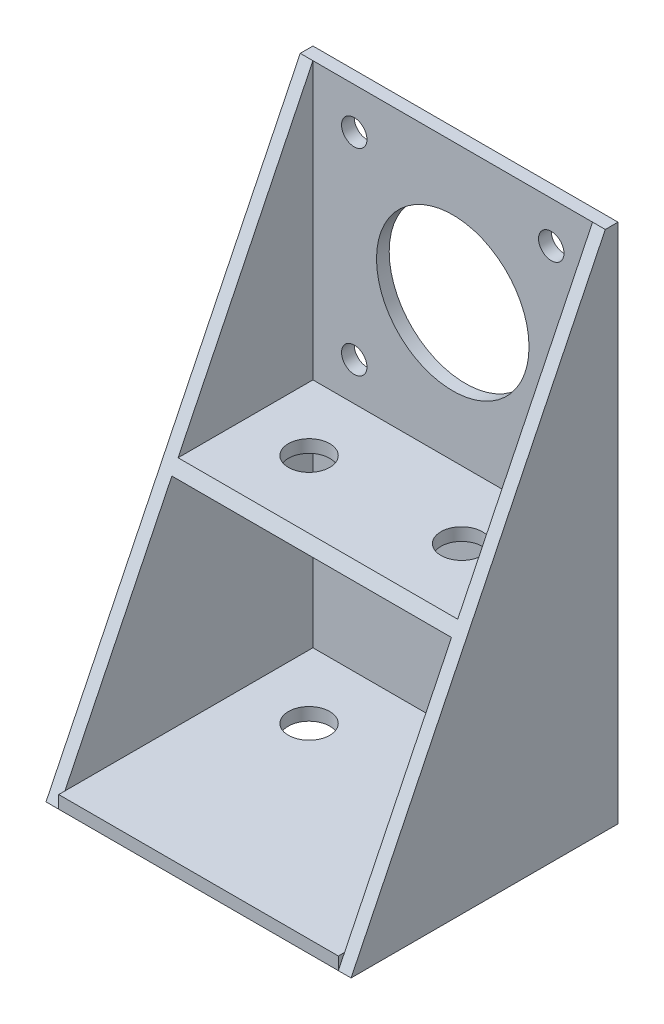
ISO-10303-21;
HEADER;
FILE_DESCRIPTION(('STEP AP214'),'2;1');
FILE_NAME('part.step','',(''),(''),'','','');
FILE_SCHEMA(('AUTOMOTIVE_DESIGN { 1 0 10303 214 1 1 1 1 }'));
ENDSEC;
DATA;
#1=APPLICATION_CONTEXT('core data for automotive mechanical design processes');
#2=APPLICATION_PROTOCOL_DEFINITION('international standard','automotive_design',2000,#1);
#3=PRODUCT_CONTEXT('',#1,'mechanical');
#4=PRODUCT('Part','Part','',(#3));
#5=PRODUCT_RELATED_PRODUCT_CATEGORY('part','',(#4));
#6=PRODUCT_DEFINITION_FORMATION('','',#4);
#7=PRODUCT_DEFINITION_CONTEXT('part definition',#1,'design');
#8=PRODUCT_DEFINITION('design','',#6,#7);
#9=PRODUCT_DEFINITION_SHAPE('','',#8);
#10=(LENGTH_UNIT() NAMED_UNIT(*) SI_UNIT(.MILLI.,.METRE.));
#11=(NAMED_UNIT(*) PLANE_ANGLE_UNIT() SI_UNIT($,.RADIAN.));
#12=(NAMED_UNIT(*) SI_UNIT($,.STERADIAN.) SOLID_ANGLE_UNIT());
#13=UNCERTAINTY_MEASURE_WITH_UNIT(LENGTH_MEASURE(1.E-05),#10,'distance_accuracy_value','');
#14=(GEOMETRIC_REPRESENTATION_CONTEXT(3) GLOBAL_UNCERTAINTY_ASSIGNED_CONTEXT((#13)) GLOBAL_UNIT_ASSIGNED_CONTEXT((#10,
#11,#12)) REPRESENTATION_CONTEXT('',''));
#15=CARTESIAN_POINT('',(0.,0.,0.));
#16=DIRECTION('',(0.,0.,1.));
#17=DIRECTION('',(1.,0.,0.));
#18=AXIS2_PLACEMENT_3D('',#15,#16,#17);
#19=CARTESIAN_POINT('',(0.,0.,2.));
#20=DIRECTION('',(0.,0.,1.));
#21=DIRECTION('',(1.,0.,0.));
#22=AXIS2_PLACEMENT_3D('',#19,#20,#21);
#23=PLANE('',#22);
#24=DIRECTION('',(1.,0.,0.));
#25=VECTOR('',#24,1.);
#26=CARTESIAN_POINT('',(-22.,-58.,2.));
#27=LINE('',#26,#25);
#28=CARTESIAN_POINT('',(-22.,-58.,2.));
#29=VERTEX_POINT('',#28);
#30=CARTESIAN_POINT('',(22.,-58.,2.));
#31=VERTEX_POINT('',#30);
#32=EDGE_CURVE('E131',#29,#31,#27,.T.);
#33=ORIENTED_EDGE('',*,*,#32,.T.);
#34=DIRECTION('',(0.,1.,0.));
#35=VECTOR('',#34,1.);
#36=CARTESIAN_POINT('',(22.,22.,2.));
#37=LINE('',#36,#35);
#38=CARTESIAN_POINT('',(22.,-23.5,2.));
#39=VERTEX_POINT('',#38);
#40=EDGE_CURVE('E157',#31,#39,#37,.T.);
#41=ORIENTED_EDGE('',*,*,#40,.T.);
#42=DIRECTION('',(1.,0.,0.));
#43=VECTOR('',#42,1.);
#44=CARTESIAN_POINT('',(-22.,-23.5,2.));
#45=LINE('',#44,#43);
#46=CARTESIAN_POINT('',(-22.,-23.5,2.));
#47=VERTEX_POINT('',#46);
#48=EDGE_CURVE('E154',#47,#39,#45,.T.);
#49=ORIENTED_EDGE('',*,*,#48,.F.);
#50=DIRECTION('',(0.,-1.,0.));
#51=VECTOR('',#50,1.);
#52=CARTESIAN_POINT('',(-22.,22.,2.));
#53=LINE('',#52,#51);
#54=EDGE_CURVE('E42',#47,#29,#53,.T.);
#55=ORIENTED_EDGE('',*,*,#54,.T.);
#56=EDGE_LOOP('',(#33,#41,#49,#55));
#57=FACE_BOUND('',#56,.T.);
#58=ADVANCED_FACE('F33',(#57),#23,.T.);
#59=CARTESIAN_POINT('',(-22.,22.,2.));
#60=DIRECTION('',(0.,-1.,0.));
#61=DIRECTION('',(0.,0.,-1.));
#62=AXIS2_PLACEMENT_3D('',#59,#60,#61);
#63=PLANE('',#62);
#64=DIRECTION('',(-1.,0.,0.));
#65=VECTOR('',#64,1.);
#66=CARTESIAN_POINT('',(-22.,22.,0.));
#67=LINE('',#66,#65);
#68=CARTESIAN_POINT('',(24.,22.,0.));
#69=VERTEX_POINT('',#68);
#70=CARTESIAN_POINT('',(-24.,22.,0.));
#71=VERTEX_POINT('',#70);
#72=EDGE_CURVE('E168',#69,#71,#67,.T.);
#73=ORIENTED_EDGE('',*,*,#72,.T.);
#74=DIRECTION('',(0.,0.,-1.));
#75=VECTOR('',#74,1.);
#76=CARTESIAN_POINT('',(-24.,22.,0.));
#77=LINE('',#76,#75);
#78=CARTESIAN_POINT('',(-24.,22.,2.));
#79=VERTEX_POINT('',#78);
#80=EDGE_CURVE('E238',#79,#71,#77,.T.);
#81=ORIENTED_EDGE('',*,*,#80,.F.);
#82=DIRECTION('',(1.,0.,0.));
#83=VECTOR('',#82,1.);
#84=CARTESIAN_POINT('',(-24.,22.,2.));
#85=LINE('',#84,#83);
#86=CARTESIAN_POINT('',(-22.,22.,2.));
#87=VERTEX_POINT('',#86);
#88=EDGE_CURVE('E249',#79,#87,#85,.T.);
#89=ORIENTED_EDGE('',*,*,#88,.T.);
#90=DIRECTION('',(-1.,0.,0.));
#91=VECTOR('',#90,1.);
#92=CARTESIAN_POINT('',(-22.,22.,2.));
#93=LINE('',#92,#91);
#94=CARTESIAN_POINT('',(22.,22.,2.));
#95=VERTEX_POINT('',#94);
#96=EDGE_CURVE('E155',#95,#87,#93,.T.);
#97=ORIENTED_EDGE('',*,*,#96,.F.);
#98=DIRECTION('',(-1.,0.,0.));
#99=VECTOR('',#98,1.);
#100=CARTESIAN_POINT('',(24.,22.,2.));
#101=LINE('',#100,#99);
#102=CARTESIAN_POINT('',(24.,22.,2.));
#103=VERTEX_POINT('',#102);
#104=EDGE_CURVE('E234',#103,#95,#101,.T.);
#105=ORIENTED_EDGE('',*,*,#104,.F.);
#106=DIRECTION('',(0.,0.,1.));
#107=VECTOR('',#106,1.);
#108=CARTESIAN_POINT('',(24.,22.,2.));
#109=LINE('',#108,#107);
#110=EDGE_CURVE('E220',#69,#103,#109,.T.);
#111=ORIENTED_EDGE('',*,*,#110,.F.);
#112=EDGE_LOOP('',(#73,#81,#89,#97,#105,#111));
#113=FACE_BOUND('',#112,.T.);
#114=ADVANCED_FACE('F35',(#113),#63,.F.);
#115=DIRECTION('',(-1.,0.,0.));
#116=VECTOR('',#115,1.);
#117=CARTESIAN_POINT('',(-22.,-21.5,2.));
#118=LINE('',#117,#116);
#119=CARTESIAN_POINT('',(22.,-21.5,2.));
#120=VERTEX_POINT('',#119);
#121=CARTESIAN_POINT('',(-22.,-21.5,2.));
#122=VERTEX_POINT('',#121);
#123=EDGE_CURVE('E162',#120,#122,#118,.T.);
#124=ORIENTED_EDGE('',*,*,#123,.F.);
#125=EDGE_CURVE('E170',#120,#95,#37,.T.);
#126=ORIENTED_EDGE('',*,*,#125,.T.);
#127=ORIENTED_EDGE('',*,*,#96,.T.);
#128=EDGE_CURVE('E11',#87,#122,#53,.T.);
#129=ORIENTED_EDGE('',*,*,#128,.T.);
#130=EDGE_LOOP('',(#124,#126,#127,#129));
#131=FACE_BOUND('',#130,.T.);
#132=CARTESIAN_POINT('',(15.5,-15.5,2.));
#133=DIRECTION('',(0.,0.,1.));
#134=DIRECTION('',(1.,0.,0.));
#135=AXIS2_PLACEMENT_3D('',#132,#133,#134);
#136=CIRCLE('',#135,2.);
#137=CARTESIAN_POINT('',(17.5,-15.5,2.));
#138=VERTEX_POINT('',#137);
#139=EDGE_CURVE('E277',#138,#138,#136,.T.);
#140=ORIENTED_EDGE('',*,*,#139,.F.);
#141=EDGE_LOOP('',(#140));
#142=FACE_BOUND('',#141,.T.);
#143=CARTESIAN_POINT('',(-15.5,-15.5,2.));
#144=DIRECTION('',(0.,0.,1.));
#145=DIRECTION('',(1.,0.,0.));
#146=AXIS2_PLACEMENT_3D('',#143,#144,#145);
#147=CIRCLE('',#146,2.);
#148=CARTESIAN_POINT('',(-13.5,-15.5,2.));
#149=VERTEX_POINT('',#148);
#150=EDGE_CURVE('E284',#149,#149,#147,.T.);
#151=ORIENTED_EDGE('',*,*,#150,.F.);
#152=EDGE_LOOP('',(#151));
#153=FACE_BOUND('',#152,.T.);
#154=CARTESIAN_POINT('',(15.5,15.5,2.));
#155=DIRECTION('',(0.,0.,1.));
#156=DIRECTION('',(1.,0.,0.));
#157=AXIS2_PLACEMENT_3D('',#154,#155,#156);
#158=CIRCLE('',#157,2.);
#159=CARTESIAN_POINT('',(17.5,15.5,2.));
#160=VERTEX_POINT('',#159);
#161=EDGE_CURVE('E290',#160,#160,#158,.T.);
#162=ORIENTED_EDGE('',*,*,#161,.F.);
#163=EDGE_LOOP('',(#162));
#164=FACE_BOUND('',#163,.T.);
#165=CARTESIAN_POINT('',(0.,0.,2.));
#166=DIRECTION('',(0.,0.,1.));
#167=DIRECTION('',(1.,0.,0.));
#168=AXIS2_PLACEMENT_3D('',#165,#166,#167);
#169=CIRCLE('',#168,12.);
#170=CARTESIAN_POINT('',(12.,0.,2.));
#171=VERTEX_POINT('',#170);
#172=EDGE_CURVE('E296',#171,#171,#169,.T.);
#173=ORIENTED_EDGE('',*,*,#172,.F.);
#174=EDGE_LOOP('',(#173));
#175=FACE_BOUND('',#174,.T.);
#176=CARTESIAN_POINT('',(-15.5,15.5,2.));
#177=DIRECTION('',(0.,0.,1.));
#178=DIRECTION('',(1.,0.,0.));
#179=AXIS2_PLACEMENT_3D('',#176,#177,#178);
#180=CIRCLE('',#179,2.);
#181=CARTESIAN_POINT('',(-13.5,15.5,2.));
#182=VERTEX_POINT('',#181);
#183=EDGE_CURVE('E174',#182,#182,#180,.T.);
#184=ORIENTED_EDGE('',*,*,#183,.F.);
#185=EDGE_LOOP('',(#184));
#186=FACE_BOUND('',#185,.T.);
#187=ADVANCED_FACE('F308',(#131,#142,#153,#164,#175,#186),#23,.T.);
#188=CARTESIAN_POINT('',(0.,0.,0.));
#189=DIRECTION('',(0.,0.,1.));
#190=DIRECTION('',(1.,0.,0.));
#191=AXIS2_PLACEMENT_3D('',#188,#189,#190);
#192=PLANE('',#191);
#193=CARTESIAN_POINT('',(15.5,-15.5,0.));
#194=DIRECTION('',(0.,0.,1.));
#195=DIRECTION('',(1.,0.,0.));
#196=AXIS2_PLACEMENT_3D('',#193,#194,#195);
#197=CIRCLE('',#196,2.);
#198=CARTESIAN_POINT('',(17.5,-15.5,0.));
#199=VERTEX_POINT('',#198);
#200=EDGE_CURVE('E272',#199,#199,#197,.T.);
#201=ORIENTED_EDGE('',*,*,#200,.T.);
#202=EDGE_LOOP('',(#201));
#203=FACE_BOUND('',#202,.T.);
#204=CARTESIAN_POINT('',(-15.5,-15.5,0.));
#205=DIRECTION('',(0.,0.,1.));
#206=DIRECTION('',(1.,0.,0.));
#207=AXIS2_PLACEMENT_3D('',#204,#205,#206);
#208=CIRCLE('',#207,2.);
#209=CARTESIAN_POINT('',(-13.5,-15.5,0.));
#210=VERTEX_POINT('',#209);
#211=EDGE_CURVE('E282',#210,#210,#208,.T.);
#212=ORIENTED_EDGE('',*,*,#211,.T.);
#213=EDGE_LOOP('',(#212));
#214=FACE_BOUND('',#213,.T.);
#215=CARTESIAN_POINT('',(15.5,15.5,0.));
#216=DIRECTION('',(0.,0.,1.));
#217=DIRECTION('',(1.,0.,0.));
#218=AXIS2_PLACEMENT_3D('',#215,#216,#217);
#219=CIRCLE('',#218,2.);
#220=CARTESIAN_POINT('',(17.5,15.5,0.));
#221=VERTEX_POINT('',#220);
#222=EDGE_CURVE('E287',#221,#221,#219,.T.);
#223=ORIENTED_EDGE('',*,*,#222,.T.);
#224=EDGE_LOOP('',(#223));
#225=FACE_BOUND('',#224,.T.);
#226=CARTESIAN_POINT('',(0.,0.,0.));
#227=DIRECTION('',(0.,0.,1.));
#228=DIRECTION('',(1.,0.,0.));
#229=AXIS2_PLACEMENT_3D('',#226,#227,#228);
#230=CIRCLE('',#229,12.);
#231=CARTESIAN_POINT('',(12.,0.,0.));
#232=VERTEX_POINT('',#231);
#233=EDGE_CURVE('E293',#232,#232,#230,.T.);
#234=ORIENTED_EDGE('',*,*,#233,.T.);
#235=EDGE_LOOP('',(#234));
#236=FACE_BOUND('',#235,.T.);
#237=CARTESIAN_POINT('',(-15.5,15.5,0.));
#238=DIRECTION('',(0.,0.,1.));
#239=DIRECTION('',(1.,0.,0.));
#240=AXIS2_PLACEMENT_3D('',#237,#238,#239);
#241=CIRCLE('',#240,2.);
#242=CARTESIAN_POINT('',(-13.5,15.5,0.));
#243=VERTEX_POINT('',#242);
#244=EDGE_CURVE('E171',#243,#243,#241,.T.);
#245=ORIENTED_EDGE('',*,*,#244,.T.);
#246=EDGE_LOOP('',(#245));
#247=FACE_BOUND('',#246,.T.);
#248=ORIENTED_EDGE('',*,*,#72,.F.);
#249=DIRECTION('',(0.,1.,0.));
#250=VECTOR('',#249,1.);
#251=CARTESIAN_POINT('',(24.,22.,0.));
#252=LINE('',#251,#250);
#253=CARTESIAN_POINT('',(24.,-60.,0.));
#254=VERTEX_POINT('',#253);
#255=EDGE_CURVE('E217',#254,#69,#252,.T.);
#256=ORIENTED_EDGE('',*,*,#255,.F.);
#257=DIRECTION('',(1.,0.,0.));
#258=VECTOR('',#257,1.);
#259=CARTESIAN_POINT('',(-22.,-60.,0.));
#260=LINE('',#259,#258);
#261=CARTESIAN_POINT('',(-24.,-60.,0.));
#262=VERTEX_POINT('',#261);
#263=EDGE_CURVE('E259',#262,#254,#260,.T.);
#264=ORIENTED_EDGE('',*,*,#263,.F.);
#265=DIRECTION('',(0.,-1.,0.));
#266=VECTOR('',#265,1.);
#267=CARTESIAN_POINT('',(-24.,-60.,0.));
#268=LINE('',#267,#266);
#269=EDGE_CURVE('E241',#71,#262,#268,.T.);
#270=ORIENTED_EDGE('',*,*,#269,.F.);
#271=EDGE_LOOP('',(#248,#256,#264,#270));
#272=FACE_BOUND('',#271,.T.);
#273=ADVANCED_FACE('F310',(#203,#214,#225,#236,#247,#272),#192,.F.);
#274=CARTESIAN_POINT('',(-15.5,15.5,0.));
#275=DIRECTION('',(0.,0.,1.));
#276=DIRECTION('',(1.,0.,0.));
#277=AXIS2_PLACEMENT_3D('',#274,#275,#276);
#278=CYLINDRICAL_SURFACE('',#277,2.);
#279=ORIENTED_EDGE('',*,*,#244,.F.);
#280=EDGE_LOOP('',(#279));
#281=FACE_BOUND('',#280,.T.);
#282=ORIENTED_EDGE('',*,*,#183,.T.);
#283=EDGE_LOOP('',(#282));
#284=FACE_BOUND('',#283,.T.);
#285=ADVANCED_FACE('F306',(#281,#284),#278,.F.);
#286=CARTESIAN_POINT('',(0.,0.,0.));
#287=DIRECTION('',(0.,0.,1.));
#288=DIRECTION('',(1.,0.,0.));
#289=AXIS2_PLACEMENT_3D('',#286,#287,#288);
#290=CYLINDRICAL_SURFACE('',#289,12.);
#291=ORIENTED_EDGE('',*,*,#233,.F.);
#292=EDGE_LOOP('',(#291));
#293=FACE_BOUND('',#292,.T.);
#294=ORIENTED_EDGE('',*,*,#172,.T.);
#295=EDGE_LOOP('',(#294));
#296=FACE_BOUND('',#295,.T.);
#297=ADVANCED_FACE('F525',(#293,#296),#290,.F.);
#298=CARTESIAN_POINT('',(15.5,15.5,0.));
#299=DIRECTION('',(0.,0.,1.));
#300=DIRECTION('',(1.,0.,0.));
#301=AXIS2_PLACEMENT_3D('',#298,#299,#300);
#302=CYLINDRICAL_SURFACE('',#301,2.);
#303=ORIENTED_EDGE('',*,*,#222,.F.);
#304=EDGE_LOOP('',(#303));
#305=FACE_BOUND('',#304,.T.);
#306=ORIENTED_EDGE('',*,*,#161,.T.);
#307=EDGE_LOOP('',(#306));
#308=FACE_BOUND('',#307,.T.);
#309=ADVANCED_FACE('F521',(#305,#308),#302,.F.);
#310=CARTESIAN_POINT('',(-15.5,-15.5,0.));
#311=DIRECTION('',(0.,0.,1.));
#312=DIRECTION('',(1.,0.,0.));
#313=AXIS2_PLACEMENT_3D('',#310,#311,#312);
#314=CYLINDRICAL_SURFACE('',#313,2.);
#315=ORIENTED_EDGE('',*,*,#211,.F.);
#316=EDGE_LOOP('',(#315));
#317=FACE_BOUND('',#316,.T.);
#318=ORIENTED_EDGE('',*,*,#150,.T.);
#319=EDGE_LOOP('',(#318));
#320=FACE_BOUND('',#319,.T.);
#321=ADVANCED_FACE('F517',(#317,#320),#314,.F.);
#322=CARTESIAN_POINT('',(15.5,-15.5,0.));
#323=DIRECTION('',(0.,0.,1.));
#324=DIRECTION('',(1.,0.,0.));
#325=AXIS2_PLACEMENT_3D('',#322,#323,#324);
#326=CYLINDRICAL_SURFACE('',#325,2.);
#327=ORIENTED_EDGE('',*,*,#200,.F.);
#328=EDGE_LOOP('',(#327));
#329=FACE_BOUND('',#328,.T.);
#330=ORIENTED_EDGE('',*,*,#139,.T.);
#331=EDGE_LOOP('',(#330));
#332=FACE_BOUND('',#331,.T.);
#333=ADVANCED_FACE('F421',(#329,#332),#326,.F.);
#334=CARTESIAN_POINT('',(-22.,-60.,0.));
#335=DIRECTION('',(0.,-1.,0.));
#336=DIRECTION('',(0.,0.,-1.));
#337=AXIS2_PLACEMENT_3D('',#334,#335,#336);
#338=PLANE('',#337);
#339=CARTESIAN_POINT('',(12.,-60.,12.609756097561));
#340=DIRECTION('',(0.,1.,0.));
#341=DIRECTION('',(0.,0.,-1.));
#342=AXIS2_PLACEMENT_3D('',#339,#340,#341);
#343=CIRCLE('',#342,3.25);
#344=CARTESIAN_POINT('',(12.,-60.,9.35975609756098));
#345=VERTEX_POINT('',#344);
#346=EDGE_CURVE('E647',#345,#345,#343,.T.);
#347=ORIENTED_EDGE('',*,*,#346,.T.);
#348=EDGE_LOOP('',(#347));
#349=FACE_BOUND('',#348,.T.);
#350=CARTESIAN_POINT('',(-12.,-60.,12.609756097561));
#351=DIRECTION('',(0.,1.,0.));
#352=DIRECTION('',(0.,0.,1.));
#353=AXIS2_PLACEMENT_3D('',#350,#351,#352);
#354=CIRCLE('',#353,3.25);
#355=CARTESIAN_POINT('',(-12.,-60.,15.859756097561));
#356=VERTEX_POINT('',#355);
#357=EDGE_CURVE('E185',#356,#356,#354,.T.);
#358=ORIENTED_EDGE('',*,*,#357,.T.);
#359=EDGE_LOOP('',(#358));
#360=FACE_BOUND('',#359,.T.);
#361=DIRECTION('',(-1.,0.,0.));
#362=VECTOR('',#361,1.);
#363=CARTESIAN_POINT('',(-22.,-60.,42.));
#364=LINE('',#363,#362);
#365=CARTESIAN_POINT('',(22.,-60.,42.));
#366=VERTEX_POINT('',#365);
#367=CARTESIAN_POINT('',(-22.,-60.,42.));
#368=VERTEX_POINT('',#367);
#369=EDGE_CURVE('E152',#366,#368,#364,.T.);
#370=ORIENTED_EDGE('',*,*,#369,.T.);
#371=DIRECTION('',(1.,0.,0.));
#372=VECTOR('',#371,1.);
#373=CARTESIAN_POINT('',(-24.,-60.,42.));
#374=LINE('',#373,#372);
#375=CARTESIAN_POINT('',(-24.,-60.,42.));
#376=VERTEX_POINT('',#375);
#377=EDGE_CURVE('E253',#376,#368,#374,.T.);
#378=ORIENTED_EDGE('',*,*,#377,.F.);
#379=DIRECTION('',(0.,0.,1.));
#380=VECTOR('',#379,1.);
#381=CARTESIAN_POINT('',(-24.,-60.,2.));
#382=LINE('',#381,#380);
#383=EDGE_CURVE('E245',#262,#376,#382,.T.);
#384=ORIENTED_EDGE('',*,*,#383,.F.);
#385=ORIENTED_EDGE('',*,*,#263,.T.);
#386=DIRECTION('',(0.,0.,-1.));
#387=VECTOR('',#386,1.);
#388=CARTESIAN_POINT('',(24.,-60.,0.));
#389=LINE('',#388,#387);
#390=CARTESIAN_POINT('',(24.,-60.,42.));
#391=VERTEX_POINT('',#390);
#392=EDGE_CURVE('E225',#391,#254,#389,.T.);
#393=ORIENTED_EDGE('',*,*,#392,.F.);
#394=DIRECTION('',(-1.,0.,0.));
#395=VECTOR('',#394,1.);
#396=CARTESIAN_POINT('',(24.,-60.,42.));
#397=LINE('',#396,#395);
#398=EDGE_CURVE('E228',#391,#366,#397,.T.);
#399=ORIENTED_EDGE('',*,*,#398,.T.);
#400=EDGE_LOOP('',(#370,#378,#384,#385,#393,#399));
#401=FACE_BOUND('',#400,.T.);
#402=ADVANCED_FACE('F414',(#349,#360,#401),#338,.T.);
#403=CARTESIAN_POINT('',(-22.,-21.5,31.));
#404=DIRECTION('',(0.,-1.,0.));
#405=DIRECTION('',(0.,0.,-1.));
#406=AXIS2_PLACEMENT_3D('',#403,#404,#405);
#407=PLANE('',#406);
#408=CARTESIAN_POINT('',(12.,-21.5,12.609756097561));
#409=DIRECTION('',(0.,1.,0.));
#410=DIRECTION('',(0.,0.,-1.));
#411=AXIS2_PLACEMENT_3D('',#408,#409,#410);
#412=CIRCLE('',#411,3.25);
#413=CARTESIAN_POINT('',(12.,-21.5,9.35975609756098));
#414=VERTEX_POINT('',#413);
#415=EDGE_CURVE('E642',#414,#414,#412,.T.);
#416=ORIENTED_EDGE('',*,*,#415,.F.);
#417=EDGE_LOOP('',(#416));
#418=FACE_BOUND('',#417,.T.);
#419=CARTESIAN_POINT('',(-12.,-21.5,12.609756097561));
#420=DIRECTION('',(0.,1.,0.));
#421=DIRECTION('',(0.,0.,1.));
#422=AXIS2_PLACEMENT_3D('',#419,#420,#421);
#423=CIRCLE('',#422,3.25);
#424=CARTESIAN_POINT('',(-12.,-21.5,15.859756097561));
#425=VERTEX_POINT('',#424);
#426=EDGE_CURVE('E191',#425,#425,#423,.T.);
#427=ORIENTED_EDGE('',*,*,#426,.F.);
#428=EDGE_LOOP('',(#427));
#429=FACE_BOUND('',#428,.T.);
#430=DIRECTION('',(0.,0.,-1.));
#431=VECTOR('',#430,1.);
#432=CARTESIAN_POINT('',(-22.,-21.5,31.));
#433=LINE('',#432,#431);
#434=CARTESIAN_POINT('',(-22.,-21.5,23.219512195122));
#435=VERTEX_POINT('',#434);
#436=EDGE_CURVE('E269',#435,#122,#433,.T.);
#437=ORIENTED_EDGE('',*,*,#436,.F.);
#438=DIRECTION('',(1.,0.,0.));
#439=VECTOR('',#438,1.);
#440=CARTESIAN_POINT('',(-30.0334295591519,-21.5,23.219512195122));
#441=LINE('',#440,#439);
#442=CARTESIAN_POINT('',(22.,-21.5,23.219512195122));
#443=VERTEX_POINT('',#442);
#444=EDGE_CURVE('E213',#435,#443,#441,.T.);
#445=ORIENTED_EDGE('',*,*,#444,.T.);
#446=DIRECTION('',(0.,0.,-1.));
#447=VECTOR('',#446,1.);
#448=CARTESIAN_POINT('',(22.,-21.5,31.));
#449=LINE('',#448,#447);
#450=EDGE_CURVE('E58',#443,#120,#449,.T.);
#451=ORIENTED_EDGE('',*,*,#450,.T.);
#452=ORIENTED_EDGE('',*,*,#123,.T.);
#453=EDGE_LOOP('',(#437,#445,#451,#452));
#454=FACE_BOUND('',#453,.T.);
#455=ADVANCED_FACE('F420',(#418,#429,#454),#407,.F.);
#456=CARTESIAN_POINT('',(-22.,-23.5,31.));
#457=DIRECTION('',(0.,1.,0.));
#458=DIRECTION('',(0.,0.,1.));
#459=AXIS2_PLACEMENT_3D('',#456,#457,#458);
#460=PLANE('',#459);
#461=CARTESIAN_POINT('',(12.,-23.5,12.609756097561));
#462=DIRECTION('',(0.,1.,0.));
#463=DIRECTION('',(0.,0.,1.));
#464=AXIS2_PLACEMENT_3D('',#461,#462,#463);
#465=CIRCLE('',#464,3.25);
#466=CARTESIAN_POINT('',(12.,-23.5,15.859756097561));
#467=VERTEX_POINT('',#466);
#468=EDGE_CURVE('E196',#467,#467,#465,.T.);
#469=ORIENTED_EDGE('',*,*,#468,.T.);
#470=EDGE_LOOP('',(#469));
#471=FACE_BOUND('',#470,.T.);
#472=CARTESIAN_POINT('',(-12.,-23.5,12.609756097561));
#473=DIRECTION('',(0.,1.,0.));
#474=DIRECTION('',(0.,0.,1.));
#475=AXIS2_PLACEMENT_3D('',#472,#473,#474);
#476=CIRCLE('',#475,3.25);
#477=CARTESIAN_POINT('',(-12.,-23.5,15.859756097561));
#478=VERTEX_POINT('',#477);
#479=EDGE_CURVE('E184',#478,#478,#476,.T.);
#480=ORIENTED_EDGE('',*,*,#479,.T.);
#481=EDGE_LOOP('',(#480));
#482=FACE_BOUND('',#481,.T.);
#483=DIRECTION('',(0.,0.,-1.));
#484=VECTOR('',#483,1.);
#485=CARTESIAN_POINT('',(22.,-23.5,31.));
#486=LINE('',#485,#484);
#487=CARTESIAN_POINT('',(22.,-23.5,24.1951219512195));
#488=VERTEX_POINT('',#487);
#489=EDGE_CURVE('E179',#488,#39,#486,.T.);
#490=ORIENTED_EDGE('',*,*,#489,.F.);
#491=DIRECTION('',(1.,0.,0.));
#492=VECTOR('',#491,1.);
#493=CARTESIAN_POINT('',(-30.0334295591519,-23.5,24.1951219512195));
#494=LINE('',#493,#492);
#495=CARTESIAN_POINT('',(-22.,-23.5,24.1951219512195));
#496=VERTEX_POINT('',#495);
#497=EDGE_CURVE('E211',#496,#488,#494,.T.);
#498=ORIENTED_EDGE('',*,*,#497,.F.);
#499=DIRECTION('',(0.,0.,-1.));
#500=VECTOR('',#499,1.);
#501=CARTESIAN_POINT('',(-22.,-23.5,31.));
#502=LINE('',#501,#500);
#503=EDGE_CURVE('E50',#496,#47,#502,.T.);
#504=ORIENTED_EDGE('',*,*,#503,.T.);
#505=ORIENTED_EDGE('',*,*,#48,.T.);
#506=EDGE_LOOP('',(#490,#498,#504,#505));
#507=FACE_BOUND('',#506,.T.);
#508=ADVANCED_FACE('F379',(#471,#482,#507),#460,.F.);
#509=CARTESIAN_POINT('',(-22.,0.,0.));
#510=DIRECTION('',(-1.,0.,0.));
#511=DIRECTION('',(0.,0.,1.));
#512=AXIS2_PLACEMENT_3D('',#509,#510,#511);
#513=PLANE('',#512);
#514=DIRECTION('',(0.,0.8987684456439,-0.438423632021414));
#515=VECTOR('',#514,1.);
#516=CARTESIAN_POINT('',(-22.,22.,2.));
#517=LINE('',#516,#515);
#518=EDGE_CURVE('E237',#435,#87,#517,.T.);
#519=ORIENTED_EDGE('',*,*,#518,.F.);
#520=ORIENTED_EDGE('',*,*,#436,.T.);
#521=ORIENTED_EDGE('',*,*,#128,.F.);
#522=EDGE_LOOP('',(#519,#520,#521));
#523=FACE_BOUND('',#522,.T.);
#524=ADVANCED_FACE('F374',(#523),#513,.F.);
#525=CARTESIAN_POINT('',(-24.,22.,2.));
#526=DIRECTION('',(0.,-0.438423632021414,-0.8987684456439));
#527=DIRECTION('',(0.,0.8987684456439,-0.438423632021415));
#528=AXIS2_PLACEMENT_3D('',#525,#526,#527);
#529=PLANE('',#528);
#530=CARTESIAN_POINT('',(-22.,-58.,41.0243902439024));
#531=VERTEX_POINT('',#530);
#532=EDGE_CURVE('E242',#368,#531,#517,.T.);
#533=ORIENTED_EDGE('',*,*,#532,.T.);
#534=EDGE_CURVE('E150',#531,#496,#517,.T.);
#535=ORIENTED_EDGE('',*,*,#534,.T.);
#536=ORIENTED_EDGE('',*,*,#497,.T.);
#537=DIRECTION('',(0.,-0.8987684456439,0.438423632021414));
#538=VECTOR('',#537,1.);
#539=CARTESIAN_POINT('',(22.,-60.,42.));
#540=LINE('',#539,#538);
#541=CARTESIAN_POINT('',(22.,-58.,41.0243902439024));
#542=VERTEX_POINT('',#541);
#543=EDGE_CURVE('E231',#488,#542,#540,.T.);
#544=ORIENTED_EDGE('',*,*,#543,.T.);
#545=EDGE_CURVE('E215',#542,#366,#540,.T.);
#546=ORIENTED_EDGE('',*,*,#545,.T.);
#547=ORIENTED_EDGE('',*,*,#398,.F.);
#548=DIRECTION('',(0.,-0.8987684456439,0.438423632021414));
#549=VECTOR('',#548,1.);
#550=CARTESIAN_POINT('',(24.,-60.,42.));
#551=LINE('',#550,#549);
#552=EDGE_CURVE('E223',#103,#391,#551,.T.);
#553=ORIENTED_EDGE('',*,*,#552,.F.);
#554=ORIENTED_EDGE('',*,*,#104,.T.);
#555=EDGE_CURVE('E221',#95,#443,#540,.T.);
#556=ORIENTED_EDGE('',*,*,#555,.T.);
#557=ORIENTED_EDGE('',*,*,#444,.F.);
#558=ORIENTED_EDGE('',*,*,#518,.T.);
#559=ORIENTED_EDGE('',*,*,#88,.F.);
#560=DIRECTION('',(0.,0.8987684456439,-0.438423632021414));
#561=VECTOR('',#560,1.);
#562=CARTESIAN_POINT('',(-24.,22.,2.));
#563=LINE('',#562,#561);
#564=EDGE_CURVE('E247',#376,#79,#563,.T.);
#565=ORIENTED_EDGE('',*,*,#564,.F.);
#566=ORIENTED_EDGE('',*,*,#377,.T.);
#567=EDGE_LOOP('',(#533,#535,#536,#544,#546,#547,#553,#554,#556,#557,#558,#559,#565,#566));
#568=FACE_BOUND('',#567,.T.);
#569=ADVANCED_FACE('F378',(#568),#529,.F.);
#570=CARTESIAN_POINT('',(-24.,0.,0.));
#571=DIRECTION('',(-1.,0.,0.));
#572=DIRECTION('',(0.,0.,1.));
#573=AXIS2_PLACEMENT_3D('',#570,#571,#572);
#574=PLANE('',#573);
#575=ORIENTED_EDGE('',*,*,#80,.T.);
#576=ORIENTED_EDGE('',*,*,#269,.T.);
#577=ORIENTED_EDGE('',*,*,#383,.T.);
#578=ORIENTED_EDGE('',*,*,#564,.T.);
#579=EDGE_LOOP('',(#575,#576,#577,#578));
#580=FACE_BOUND('',#579,.T.);
#581=ADVANCED_FACE('F337',(#580),#574,.T.);
#582=ORIENTED_EDGE('',*,*,#534,.F.);
#583=DIRECTION('',(0.,0.,-1.));
#584=VECTOR('',#583,1.);
#585=CARTESIAN_POINT('',(-22.,-58.,2.));
#586=LINE('',#585,#584);
#587=EDGE_CURVE('E135',#531,#29,#586,.T.);
#588=ORIENTED_EDGE('',*,*,#587,.T.);
#589=ORIENTED_EDGE('',*,*,#54,.F.);
#590=ORIENTED_EDGE('',*,*,#503,.F.);
#591=EDGE_LOOP('',(#582,#588,#589,#590));
#592=FACE_BOUND('',#591,.T.);
#593=ADVANCED_FACE('F149',(#592),#513,.F.);
#594=CARTESIAN_POINT('',(22.,0.,0.));
#595=DIRECTION('',(-1.,0.,0.));
#596=DIRECTION('',(0.,-1.,0.));
#597=AXIS2_PLACEMENT_3D('',#594,#595,#596);
#598=PLANE('',#597);
#599=ORIENTED_EDGE('',*,*,#125,.F.);
#600=ORIENTED_EDGE('',*,*,#450,.F.);
#601=ORIENTED_EDGE('',*,*,#555,.F.);
#602=EDGE_LOOP('',(#599,#600,#601));
#603=FACE_BOUND('',#602,.T.);
#604=ADVANCED_FACE('F364',(#603),#598,.T.);
#605=CARTESIAN_POINT('',(24.,0.,0.));
#606=DIRECTION('',(-1.,0.,0.));
#607=DIRECTION('',(0.,-1.,0.));
#608=AXIS2_PLACEMENT_3D('',#605,#606,#607);
#609=PLANE('',#608);
#610=ORIENTED_EDGE('',*,*,#255,.T.);
#611=ORIENTED_EDGE('',*,*,#110,.T.);
#612=ORIENTED_EDGE('',*,*,#552,.T.);
#613=ORIENTED_EDGE('',*,*,#392,.T.);
#614=EDGE_LOOP('',(#610,#611,#612,#613));
#615=FACE_BOUND('',#614,.T.);
#616=ADVANCED_FACE('F358',(#615),#609,.F.);
#617=DIRECTION('',(0.,0.,1.));
#618=VECTOR('',#617,1.);
#619=CARTESIAN_POINT('',(22.,-58.,2.));
#620=LINE('',#619,#618);
#621=EDGE_CURVE('E139',#31,#542,#620,.T.);
#622=ORIENTED_EDGE('',*,*,#621,.T.);
#623=ORIENTED_EDGE('',*,*,#543,.F.);
#624=ORIENTED_EDGE('',*,*,#489,.T.);
#625=ORIENTED_EDGE('',*,*,#40,.F.);
#626=EDGE_LOOP('',(#622,#623,#624,#625));
#627=FACE_BOUND('',#626,.T.);
#628=ADVANCED_FACE('F363',(#627),#598,.T.);
#629=CARTESIAN_POINT('',(-22.,-58.,2.));
#630=DIRECTION('',(-1.,0.,0.));
#631=DIRECTION('',(0.,0.,1.));
#632=AXIS2_PLACEMENT_3D('',#629,#630,#631);
#633=PLANE('',#632);
#634=ORIENTED_EDGE('',*,*,#532,.F.);
#635=DIRECTION('',(0.,-1.,0.));
#636=VECTOR('',#635,1.);
#637=CARTESIAN_POINT('',(-22.,-58.,42.));
#638=LINE('',#637,#636);
#639=CARTESIAN_POINT('',(-22.,-58.,42.));
#640=VERTEX_POINT('',#639);
#641=EDGE_CURVE('E208',#640,#368,#638,.T.);
#642=ORIENTED_EDGE('',*,*,#641,.F.);
#643=EDGE_CURVE('E144',#640,#531,#586,.T.);
#644=ORIENTED_EDGE('',*,*,#643,.T.);
#645=EDGE_LOOP('',(#634,#642,#644));
#646=FACE_BOUND('',#645,.T.);
#647=ADVANCED_FACE('F429',(#646),#633,.T.);
#648=CARTESIAN_POINT('',(22.,-58.,2.));
#649=DIRECTION('',(1.,0.,0.));
#650=DIRECTION('',(0.,0.,-1.));
#651=AXIS2_PLACEMENT_3D('',#648,#649,#650);
#652=PLANE('',#651);
#653=ORIENTED_EDGE('',*,*,#545,.F.);
#654=CARTESIAN_POINT('',(22.,-58.,42.));
#655=VERTEX_POINT('',#654);
#656=EDGE_CURVE('E143',#542,#655,#620,.T.);
#657=ORIENTED_EDGE('',*,*,#656,.T.);
#658=DIRECTION('',(0.,-1.,0.));
#659=VECTOR('',#658,1.);
#660=CARTESIAN_POINT('',(22.,-58.,42.));
#661=LINE('',#660,#659);
#662=EDGE_CURVE('E205',#655,#366,#661,.T.);
#663=ORIENTED_EDGE('',*,*,#662,.T.);
#664=EDGE_LOOP('',(#653,#657,#663));
#665=FACE_BOUND('',#664,.T.);
#666=ADVANCED_FACE('F435',(#665),#652,.T.);
#667=CARTESIAN_POINT('',(-22.,-58.,42.));
#668=DIRECTION('',(0.,0.,1.));
#669=DIRECTION('',(1.,0.,0.));
#670=AXIS2_PLACEMENT_3D('',#667,#668,#669);
#671=PLANE('',#670);
#672=ORIENTED_EDGE('',*,*,#369,.F.);
#673=ORIENTED_EDGE('',*,*,#662,.F.);
#674=DIRECTION('',(-1.,0.,0.));
#675=VECTOR('',#674,1.);
#676=CARTESIAN_POINT('',(-22.,-58.,42.));
#677=LINE('',#676,#675);
#678=EDGE_CURVE('E202',#655,#640,#677,.T.);
#679=ORIENTED_EDGE('',*,*,#678,.T.);
#680=ORIENTED_EDGE('',*,*,#641,.T.);
#681=EDGE_LOOP('',(#672,#673,#679,#680));
#682=FACE_BOUND('',#681,.T.);
#683=ADVANCED_FACE('F444',(#682),#671,.T.);
#684=CARTESIAN_POINT('',(0.,-58.,0.));
#685=DIRECTION('',(0.,1.,0.));
#686=DIRECTION('',(0.,0.,1.));
#687=AXIS2_PLACEMENT_3D('',#684,#685,#686);
#688=PLANE('',#687);
#689=CARTESIAN_POINT('',(12.,-58.,12.609756097561));
#690=DIRECTION('',(0.,1.,0.));
#691=DIRECTION('',(0.,0.,1.));
#692=AXIS2_PLACEMENT_3D('',#689,#690,#691);
#693=CIRCLE('',#692,3.25);
#694=CARTESIAN_POINT('',(12.,-58.,15.859756097561));
#695=VERTEX_POINT('',#694);
#696=EDGE_CURVE('E37',#695,#695,#693,.T.);
#697=ORIENTED_EDGE('',*,*,#696,.F.);
#698=EDGE_LOOP('',(#697));
#699=FACE_BOUND('',#698,.T.);
#700=CARTESIAN_POINT('',(-12.,-58.,12.609756097561));
#701=DIRECTION('',(0.,1.,0.));
#702=DIRECTION('',(0.,0.,1.));
#703=AXIS2_PLACEMENT_3D('',#700,#701,#702);
#704=CIRCLE('',#703,3.25);
#705=CARTESIAN_POINT('',(-12.,-58.,15.859756097561));
#706=VERTEX_POINT('',#705);
#707=EDGE_CURVE('E182',#706,#706,#704,.T.);
#708=ORIENTED_EDGE('',*,*,#707,.F.);
#709=EDGE_LOOP('',(#708));
#710=FACE_BOUND('',#709,.T.);
#711=ORIENTED_EDGE('',*,*,#643,.F.);
#712=ORIENTED_EDGE('',*,*,#678,.F.);
#713=ORIENTED_EDGE('',*,*,#656,.F.);
#714=ORIENTED_EDGE('',*,*,#621,.F.);
#715=ORIENTED_EDGE('',*,*,#32,.F.);
#716=ORIENTED_EDGE('',*,*,#587,.F.);
#717=EDGE_LOOP('',(#711,#712,#713,#714,#715,#716));
#718=FACE_BOUND('',#717,.T.);
#719=ADVANCED_FACE('F134',(#699,#710,#718),#688,.T.);
#720=CARTESIAN_POINT('',(-12.,-60.,12.609756097561));
#721=DIRECTION('',(0.,1.,0.));
#722=DIRECTION('',(0.,0.,1.));
#723=AXIS2_PLACEMENT_3D('',#720,#721,#722);
#724=CYLINDRICAL_SURFACE('',#723,3.25);
#725=ORIENTED_EDGE('',*,*,#707,.T.);
#726=EDGE_LOOP('',(#725));
#727=FACE_BOUND('',#726,.T.);
#728=ORIENTED_EDGE('',*,*,#357,.F.);
#729=EDGE_LOOP('',(#728));
#730=FACE_BOUND('',#729,.T.);
#731=ADVANCED_FACE('F460',(#727,#730),#724,.F.);
#732=ORIENTED_EDGE('',*,*,#426,.T.);
#733=EDGE_LOOP('',(#732));
#734=FACE_BOUND('',#733,.T.);
#735=ORIENTED_EDGE('',*,*,#479,.F.);
#736=EDGE_LOOP('',(#735));
#737=FACE_BOUND('',#736,.T.);
#738=ADVANCED_FACE('F470',(#734,#737),#724,.F.);
#739=CARTESIAN_POINT('',(12.,-60.,12.609756097561));
#740=DIRECTION('',(0.,1.,0.));
#741=DIRECTION('',(0.,0.,1.));
#742=AXIS2_PLACEMENT_3D('',#739,#740,#741);
#743=CYLINDRICAL_SURFACE('',#742,3.25);
#744=ORIENTED_EDGE('',*,*,#696,.T.);
#745=EDGE_LOOP('',(#744));
#746=FACE_BOUND('',#745,.T.);
#747=ORIENTED_EDGE('',*,*,#346,.F.);
#748=EDGE_LOOP('',(#747));
#749=FACE_BOUND('',#748,.T.);
#750=ADVANCED_FACE('F478',(#746,#749),#743,.F.);
#751=ORIENTED_EDGE('',*,*,#415,.T.);
#752=EDGE_LOOP('',(#751));
#753=FACE_BOUND('',#752,.T.);
#754=ORIENTED_EDGE('',*,*,#468,.F.);
#755=EDGE_LOOP('',(#754));
#756=FACE_BOUND('',#755,.T.);
#757=ADVANCED_FACE('F486',(#753,#756),#743,.F.);
#758=CLOSED_SHELL('',(#58,#114,#187,#273,#285,#297,#309,#321,#333,#402,#455,#508,#524,#569,#581,
#593,#604,#616,#628,#647,#666,#683,#719,#731,#738,#750,#757));
#759=MANIFOLD_SOLID_BREP('B2',#758);
#760=ADVANCED_BREP_SHAPE_REPRESENTATION('',(#18,#759),#14);
#761=SHAPE_DEFINITION_REPRESENTATION(#9,#760);
ENDSEC;
END-ISO-10303-21;
